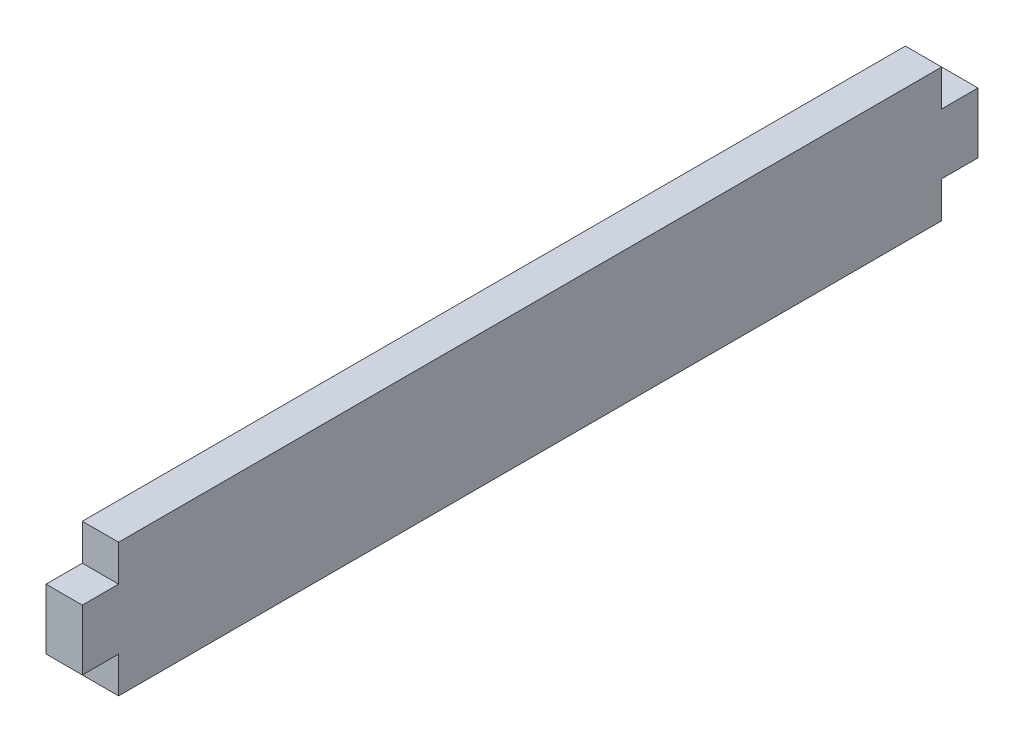
ISO-10303-21;
HEADER;
FILE_DESCRIPTION(('STEP AP214'),'2;1');
FILE_NAME('part.step','',(''),(''),'','','');
FILE_SCHEMA(('AUTOMOTIVE_DESIGN { 1 0 10303 214 1 1 1 1 }'));
ENDSEC;
DATA;
#1=APPLICATION_CONTEXT('core data for automotive mechanical design processes');
#2=APPLICATION_PROTOCOL_DEFINITION('international standard','automotive_design',2000,#1);
#3=PRODUCT_CONTEXT('',#1,'mechanical');
#4=PRODUCT('Part','Part','',(#3));
#5=PRODUCT_RELATED_PRODUCT_CATEGORY('part','',(#4));
#6=PRODUCT_DEFINITION_FORMATION('','',#4);
#7=PRODUCT_DEFINITION_CONTEXT('part definition',#1,'design');
#8=PRODUCT_DEFINITION('design','',#6,#7);
#9=PRODUCT_DEFINITION_SHAPE('','',#8);
#10=(LENGTH_UNIT() NAMED_UNIT(*) SI_UNIT(.MILLI.,.METRE.));
#11=(NAMED_UNIT(*) PLANE_ANGLE_UNIT() SI_UNIT($,.RADIAN.));
#12=(NAMED_UNIT(*) SI_UNIT($,.STERADIAN.) SOLID_ANGLE_UNIT());
#13=UNCERTAINTY_MEASURE_WITH_UNIT(LENGTH_MEASURE(1.E-05),#10,'distance_accuracy_value','');
#14=(GEOMETRIC_REPRESENTATION_CONTEXT(3) GLOBAL_UNCERTAINTY_ASSIGNED_CONTEXT((#13)) GLOBAL_UNIT_ASSIGNED_CONTEXT((#10,
#11,#12)) REPRESENTATION_CONTEXT('',''));
#15=CARTESIAN_POINT('',(0.,0.,0.));
#16=DIRECTION('',(0.,0.,1.));
#17=DIRECTION('',(1.,0.,0.));
#18=AXIS2_PLACEMENT_3D('',#15,#16,#17);
#19=CARTESIAN_POINT('',(-3.,3.,0.));
#20=DIRECTION('',(0.,-1.,0.));
#21=DIRECTION('',(0.,0.,-1.));
#22=AXIS2_PLACEMENT_3D('',#19,#20,#21);
#23=PLANE('',#22);
#24=DIRECTION('',(0.,0.,-1.));
#25=VECTOR('',#24,1.);
#26=CARTESIAN_POINT('',(0.,3.,0.));
#27=LINE('',#26,#25);
#28=CARTESIAN_POINT('',(0.,3.,0.));
#29=VERTEX_POINT('',#28);
#30=CARTESIAN_POINT('',(0.,3.,-3.));
#31=VERTEX_POINT('',#30);
#32=EDGE_CURVE('E145',#29,#31,#27,.T.);
#33=ORIENTED_EDGE('',*,*,#32,.F.);
#34=DIRECTION('',(1.,0.,0.));
#35=VECTOR('',#34,1.);
#36=CARTESIAN_POINT('',(-3.,3.,0.));
#37=LINE('',#36,#35);
#38=CARTESIAN_POINT('',(-3.,3.,0.));
#39=VERTEX_POINT('',#38);
#40=EDGE_CURVE('E32',#39,#29,#37,.T.);
#41=ORIENTED_EDGE('',*,*,#40,.F.);
#42=DIRECTION('',(0.,0.,-1.));
#43=VECTOR('',#42,1.);
#44=CARTESIAN_POINT('',(-3.,3.,0.));
#45=LINE('',#44,#43);
#46=CARTESIAN_POINT('',(-3.,3.,-3.));
#47=VERTEX_POINT('',#46);
#48=EDGE_CURVE('E136',#39,#47,#45,.T.);
#49=ORIENTED_EDGE('',*,*,#48,.T.);
#50=DIRECTION('',(1.,0.,0.));
#51=VECTOR('',#50,1.);
#52=CARTESIAN_POINT('',(-3.,3.,-3.));
#53=LINE('',#52,#51);
#54=EDGE_CURVE('E10',#47,#31,#53,.T.);
#55=ORIENTED_EDGE('',*,*,#54,.T.);
#56=EDGE_LOOP('',(#33,#41,#49,#55));
#57=FACE_BOUND('',#56,.T.);
#58=ADVANCED_FACE('F16',(#57),#23,.T.);
#59=CARTESIAN_POINT('',(-3.,3.,-3.));
#60=DIRECTION('',(0.,0.,-1.));
#61=DIRECTION('',(-1.,0.,0.));
#62=AXIS2_PLACEMENT_3D('',#59,#60,#61);
#63=PLANE('',#62);
#64=DIRECTION('',(0.,1.,0.));
#65=VECTOR('',#64,1.);
#66=CARTESIAN_POINT('',(0.,3.,-3.));
#67=LINE('',#66,#65);
#68=CARTESIAN_POINT('',(0.,7.99999999999999,-3.));
#69=VERTEX_POINT('',#68);
#70=EDGE_CURVE('E140',#31,#69,#67,.T.);
#71=ORIENTED_EDGE('',*,*,#70,.F.);
#72=ORIENTED_EDGE('',*,*,#54,.F.);
#73=DIRECTION('',(0.,1.,0.));
#74=VECTOR('',#73,1.);
#75=CARTESIAN_POINT('',(-3.,3.,-3.));
#76=LINE('',#75,#74);
#77=CARTESIAN_POINT('',(-3.,7.99999999999999,-3.));
#78=VERTEX_POINT('',#77);
#79=EDGE_CURVE('E138',#47,#78,#76,.T.);
#80=ORIENTED_EDGE('',*,*,#79,.T.);
#81=DIRECTION('',(1.,0.,0.));
#82=VECTOR('',#81,1.);
#83=CARTESIAN_POINT('',(-3.,7.99999999999999,-3.));
#84=LINE('',#83,#82);
#85=EDGE_CURVE('E24',#78,#69,#84,.T.);
#86=ORIENTED_EDGE('',*,*,#85,.T.);
#87=EDGE_LOOP('',(#71,#72,#80,#86));
#88=FACE_BOUND('',#87,.T.);
#89=ADVANCED_FACE('F198',(#88),#63,.T.);
#90=CARTESIAN_POINT('',(-3.,7.99999999999999,-3.));
#91=DIRECTION('',(0.,1.,0.));
#92=DIRECTION('',(0.,0.,1.));
#93=AXIS2_PLACEMENT_3D('',#90,#91,#92);
#94=PLANE('',#93);
#95=DIRECTION('',(0.,0.,1.));
#96=VECTOR('',#95,1.);
#97=CARTESIAN_POINT('',(0.,7.99999999999999,-3.));
#98=LINE('',#97,#96);
#99=CARTESIAN_POINT('',(0.,7.99999999999999,0.));
#100=VERTEX_POINT('',#99);
#101=EDGE_CURVE('E144',#69,#100,#98,.T.);
#102=ORIENTED_EDGE('',*,*,#101,.F.);
#103=ORIENTED_EDGE('',*,*,#85,.F.);
#104=DIRECTION('',(0.,0.,1.));
#105=VECTOR('',#104,1.);
#106=CARTESIAN_POINT('',(-3.,7.99999999999999,-3.));
#107=LINE('',#106,#105);
#108=CARTESIAN_POINT('',(-3.,7.99999999999999,0.));
#109=VERTEX_POINT('',#108);
#110=EDGE_CURVE('E207',#78,#109,#107,.T.);
#111=ORIENTED_EDGE('',*,*,#110,.T.);
#112=DIRECTION('',(1.,0.,0.));
#113=VECTOR('',#112,1.);
#114=CARTESIAN_POINT('',(-3.,7.99999999999999,0.));
#115=LINE('',#114,#113);
#116=EDGE_CURVE('E196',#109,#100,#115,.T.);
#117=ORIENTED_EDGE('',*,*,#116,.T.);
#118=EDGE_LOOP('',(#102,#103,#111,#117));
#119=FACE_BOUND('',#118,.T.);
#120=ADVANCED_FACE('F202',(#119),#94,.T.);
#121=CARTESIAN_POINT('',(-3.,7.99999999999999,0.));
#122=DIRECTION('',(0.,0.,-1.));
#123=DIRECTION('',(-1.,0.,0.));
#124=AXIS2_PLACEMENT_3D('',#121,#122,#123);
#125=PLANE('',#124);
#126=DIRECTION('',(0.,1.,0.));
#127=VECTOR('',#126,1.);
#128=CARTESIAN_POINT('',(0.,7.99999999999999,0.));
#129=LINE('',#128,#127);
#130=CARTESIAN_POINT('',(0.,11.,0.));
#131=VERTEX_POINT('',#130);
#132=EDGE_CURVE('E149',#100,#131,#129,.T.);
#133=ORIENTED_EDGE('',*,*,#132,.F.);
#134=ORIENTED_EDGE('',*,*,#116,.F.);
#135=DIRECTION('',(0.,1.,0.));
#136=VECTOR('',#135,1.);
#137=CARTESIAN_POINT('',(-3.,7.99999999999999,0.));
#138=LINE('',#137,#136);
#139=CARTESIAN_POINT('',(-3.,11.,0.));
#140=VERTEX_POINT('',#139);
#141=EDGE_CURVE('E209',#109,#140,#138,.T.);
#142=ORIENTED_EDGE('',*,*,#141,.T.);
#143=DIRECTION('',(1.,0.,0.));
#144=VECTOR('',#143,1.);
#145=CARTESIAN_POINT('',(-3.,11.,0.));
#146=LINE('',#145,#144);
#147=EDGE_CURVE('E194',#140,#131,#146,.T.);
#148=ORIENTED_EDGE('',*,*,#147,.T.);
#149=EDGE_LOOP('',(#133,#134,#142,#148));
#150=FACE_BOUND('',#149,.T.);
#151=ADVANCED_FACE('F245',(#150),#125,.T.);
#152=CARTESIAN_POINT('',(-3.,11.,0.));
#153=DIRECTION('',(0.,1.,0.));
#154=DIRECTION('',(0.,0.,1.));
#155=AXIS2_PLACEMENT_3D('',#152,#153,#154);
#156=PLANE('',#155);
#157=DIRECTION('',(0.,0.,1.));
#158=VECTOR('',#157,1.);
#159=CARTESIAN_POINT('',(0.,11.,0.));
#160=LINE('',#159,#158);
#161=CARTESIAN_POINT('',(0.,11.,68.));
#162=VERTEX_POINT('',#161);
#163=EDGE_CURVE('E153',#131,#162,#160,.T.);
#164=ORIENTED_EDGE('',*,*,#163,.F.);
#165=ORIENTED_EDGE('',*,*,#147,.F.);
#166=DIRECTION('',(0.,0.,1.));
#167=VECTOR('',#166,1.);
#168=CARTESIAN_POINT('',(-3.,11.,0.));
#169=LINE('',#168,#167);
#170=CARTESIAN_POINT('',(-3.,11.,68.));
#171=VERTEX_POINT('',#170);
#172=EDGE_CURVE('E214',#140,#171,#169,.T.);
#173=ORIENTED_EDGE('',*,*,#172,.T.);
#174=DIRECTION('',(1.,0.,0.));
#175=VECTOR('',#174,1.);
#176=CARTESIAN_POINT('',(-3.,11.,68.));
#177=LINE('',#176,#175);
#178=EDGE_CURVE('E192',#171,#162,#177,.T.);
#179=ORIENTED_EDGE('',*,*,#178,.T.);
#180=EDGE_LOOP('',(#164,#165,#173,#179));
#181=FACE_BOUND('',#180,.T.);
#182=ADVANCED_FACE('F243',(#181),#156,.T.);
#183=CARTESIAN_POINT('',(-3.,11.,68.));
#184=DIRECTION('',(0.,0.,1.));
#185=DIRECTION('',(1.,0.,0.));
#186=AXIS2_PLACEMENT_3D('',#183,#184,#185);
#187=PLANE('',#186);
#188=DIRECTION('',(0.,-1.,0.));
#189=VECTOR('',#188,1.);
#190=CARTESIAN_POINT('',(0.,11.,68.));
#191=LINE('',#190,#189);
#192=CARTESIAN_POINT('',(0.,7.99999999999999,68.));
#193=VERTEX_POINT('',#192);
#194=EDGE_CURVE('E157',#162,#193,#191,.T.);
#195=ORIENTED_EDGE('',*,*,#194,.F.);
#196=ORIENTED_EDGE('',*,*,#178,.F.);
#197=DIRECTION('',(0.,-1.,0.));
#198=VECTOR('',#197,1.);
#199=CARTESIAN_POINT('',(-3.,11.,68.));
#200=LINE('',#199,#198);
#201=CARTESIAN_POINT('',(-3.,7.99999999999999,68.));
#202=VERTEX_POINT('',#201);
#203=EDGE_CURVE('E217',#171,#202,#200,.T.);
#204=ORIENTED_EDGE('',*,*,#203,.T.);
#205=DIRECTION('',(1.,0.,0.));
#206=VECTOR('',#205,1.);
#207=CARTESIAN_POINT('',(-3.,7.99999999999999,68.));
#208=LINE('',#207,#206);
#209=EDGE_CURVE('E190',#202,#193,#208,.T.);
#210=ORIENTED_EDGE('',*,*,#209,.T.);
#211=EDGE_LOOP('',(#195,#196,#204,#210));
#212=FACE_BOUND('',#211,.T.);
#213=ADVANCED_FACE('F239',(#212),#187,.T.);
#214=CARTESIAN_POINT('',(-3.,7.99999999999999,68.));
#215=DIRECTION('',(0.,1.,0.));
#216=DIRECTION('',(0.,0.,1.));
#217=AXIS2_PLACEMENT_3D('',#214,#215,#216);
#218=PLANE('',#217);
#219=DIRECTION('',(0.,0.,1.));
#220=VECTOR('',#219,1.);
#221=CARTESIAN_POINT('',(0.,7.99999999999999,68.));
#222=LINE('',#221,#220);
#223=CARTESIAN_POINT('',(0.,7.99999999999999,71.));
#224=VERTEX_POINT('',#223);
#225=EDGE_CURVE('E161',#193,#224,#222,.T.);
#226=ORIENTED_EDGE('',*,*,#225,.F.);
#227=ORIENTED_EDGE('',*,*,#209,.F.);
#228=DIRECTION('',(0.,0.,1.));
#229=VECTOR('',#228,1.);
#230=CARTESIAN_POINT('',(-3.,7.99999999999999,68.));
#231=LINE('',#230,#229);
#232=CARTESIAN_POINT('',(-3.,7.99999999999999,71.));
#233=VERTEX_POINT('',#232);
#234=EDGE_CURVE('E220',#202,#233,#231,.T.);
#235=ORIENTED_EDGE('',*,*,#234,.T.);
#236=DIRECTION('',(1.,0.,0.));
#237=VECTOR('',#236,1.);
#238=CARTESIAN_POINT('',(-3.,7.99999999999999,71.));
#239=LINE('',#238,#237);
#240=EDGE_CURVE('E188',#233,#224,#239,.T.);
#241=ORIENTED_EDGE('',*,*,#240,.T.);
#242=EDGE_LOOP('',(#226,#227,#235,#241));
#243=FACE_BOUND('',#242,.T.);
#244=ADVANCED_FACE('F236',(#243),#218,.T.);
#245=CARTESIAN_POINT('',(-3.,7.99999999999999,71.));
#246=DIRECTION('',(0.,0.,1.));
#247=DIRECTION('',(1.,0.,0.));
#248=AXIS2_PLACEMENT_3D('',#245,#246,#247);
#249=PLANE('',#248);
#250=DIRECTION('',(0.,-1.,0.));
#251=VECTOR('',#250,1.);
#252=CARTESIAN_POINT('',(0.,7.99999999999999,71.));
#253=LINE('',#252,#251);
#254=CARTESIAN_POINT('',(0.,2.99999999999999,71.));
#255=VERTEX_POINT('',#254);
#256=EDGE_CURVE('E165',#224,#255,#253,.T.);
#257=ORIENTED_EDGE('',*,*,#256,.F.);
#258=ORIENTED_EDGE('',*,*,#240,.F.);
#259=DIRECTION('',(0.,-1.,0.));
#260=VECTOR('',#259,1.);
#261=CARTESIAN_POINT('',(-3.,7.99999999999999,71.));
#262=LINE('',#261,#260);
#263=CARTESIAN_POINT('',(-3.,2.99999999999999,71.));
#264=VERTEX_POINT('',#263);
#265=EDGE_CURVE('E223',#233,#264,#262,.T.);
#266=ORIENTED_EDGE('',*,*,#265,.T.);
#267=DIRECTION('',(1.,0.,0.));
#268=VECTOR('',#267,1.);
#269=CARTESIAN_POINT('',(-3.,2.99999999999999,71.));
#270=LINE('',#269,#268);
#271=EDGE_CURVE('E186',#264,#255,#270,.T.);
#272=ORIENTED_EDGE('',*,*,#271,.T.);
#273=EDGE_LOOP('',(#257,#258,#266,#272));
#274=FACE_BOUND('',#273,.T.);
#275=ADVANCED_FACE('F233',(#274),#249,.T.);
#276=CARTESIAN_POINT('',(-3.,2.99999999999999,71.));
#277=DIRECTION('',(0.,-1.,0.));
#278=DIRECTION('',(0.,0.,-1.));
#279=AXIS2_PLACEMENT_3D('',#276,#277,#278);
#280=PLANE('',#279);
#281=DIRECTION('',(0.,0.,-1.));
#282=VECTOR('',#281,1.);
#283=CARTESIAN_POINT('',(0.,2.99999999999999,71.));
#284=LINE('',#283,#282);
#285=CARTESIAN_POINT('',(0.,2.99999999999999,68.));
#286=VERTEX_POINT('',#285);
#287=EDGE_CURVE('E169',#255,#286,#284,.T.);
#288=ORIENTED_EDGE('',*,*,#287,.F.);
#289=ORIENTED_EDGE('',*,*,#271,.F.);
#290=DIRECTION('',(0.,0.,-1.));
#291=VECTOR('',#290,1.);
#292=CARTESIAN_POINT('',(-3.,2.99999999999999,71.));
#293=LINE('',#292,#291);
#294=CARTESIAN_POINT('',(-3.,2.99999999999999,68.));
#295=VERTEX_POINT('',#294);
#296=EDGE_CURVE('E127',#264,#295,#293,.T.);
#297=ORIENTED_EDGE('',*,*,#296,.T.);
#298=DIRECTION('',(1.,0.,0.));
#299=VECTOR('',#298,1.);
#300=CARTESIAN_POINT('',(-3.,2.99999999999999,68.));
#301=LINE('',#300,#299);
#302=EDGE_CURVE('E119',#295,#286,#301,.T.);
#303=ORIENTED_EDGE('',*,*,#302,.T.);
#304=EDGE_LOOP('',(#288,#289,#297,#303));
#305=FACE_BOUND('',#304,.T.);
#306=ADVANCED_FACE('F227',(#305),#280,.T.);
#307=CARTESIAN_POINT('',(-3.,2.99999999999999,68.));
#308=DIRECTION('',(0.,0.,1.));
#309=DIRECTION('',(1.,0.,0.));
#310=AXIS2_PLACEMENT_3D('',#307,#308,#309);
#311=PLANE('',#310);
#312=DIRECTION('',(0.,-1.,0.));
#313=VECTOR('',#312,1.);
#314=CARTESIAN_POINT('',(0.,2.99999999999999,68.));
#315=LINE('',#314,#313);
#316=CARTESIAN_POINT('',(0.,0.,68.));
#317=VERTEX_POINT('',#316);
#318=EDGE_CURVE('E173',#286,#317,#315,.T.);
#319=ORIENTED_EDGE('',*,*,#318,.F.);
#320=ORIENTED_EDGE('',*,*,#302,.F.);
#321=DIRECTION('',(0.,-1.,0.));
#322=VECTOR('',#321,1.);
#323=CARTESIAN_POINT('',(-3.,2.99999999999999,68.));
#324=LINE('',#323,#322);
#325=CARTESIAN_POINT('',(-3.,0.,68.));
#326=VERTEX_POINT('',#325);
#327=EDGE_CURVE('E122',#295,#326,#324,.T.);
#328=ORIENTED_EDGE('',*,*,#327,.T.);
#329=DIRECTION('',(1.,0.,0.));
#330=VECTOR('',#329,1.);
#331=CARTESIAN_POINT('',(-3.,0.,68.));
#332=LINE('',#331,#330);
#333=EDGE_CURVE('E108',#326,#317,#332,.T.);
#334=ORIENTED_EDGE('',*,*,#333,.T.);
#335=EDGE_LOOP('',(#319,#320,#328,#334));
#336=FACE_BOUND('',#335,.T.);
#337=ADVANCED_FACE('F123',(#336),#311,.T.);
#338=CARTESIAN_POINT('',(-3.,0.,68.));
#339=DIRECTION('',(0.,-1.,0.));
#340=DIRECTION('',(0.,0.,-1.));
#341=AXIS2_PLACEMENT_3D('',#338,#339,#340);
#342=PLANE('',#341);
#343=DIRECTION('',(0.,0.,-1.));
#344=VECTOR('',#343,1.);
#345=CARTESIAN_POINT('',(0.,0.,68.));
#346=LINE('',#345,#344);
#347=CARTESIAN_POINT('',(0.,0.,0.));
#348=VERTEX_POINT('',#347);
#349=EDGE_CURVE('E115',#317,#348,#346,.T.);
#350=ORIENTED_EDGE('',*,*,#349,.F.);
#351=ORIENTED_EDGE('',*,*,#333,.F.);
#352=DIRECTION('',(0.,0.,-1.));
#353=VECTOR('',#352,1.);
#354=CARTESIAN_POINT('',(-3.,0.,68.));
#355=LINE('',#354,#353);
#356=CARTESIAN_POINT('',(-3.,0.,0.));
#357=VERTEX_POINT('',#356);
#358=EDGE_CURVE('E112',#326,#357,#355,.T.);
#359=ORIENTED_EDGE('',*,*,#358,.T.);
#360=DIRECTION('',(1.,0.,0.));
#361=VECTOR('',#360,1.);
#362=CARTESIAN_POINT('',(-3.,0.,0.));
#363=LINE('',#362,#361);
#364=EDGE_CURVE('E72',#357,#348,#363,.T.);
#365=ORIENTED_EDGE('',*,*,#364,.T.);
#366=EDGE_LOOP('',(#350,#351,#359,#365));
#367=FACE_BOUND('',#366,.T.);
#368=ADVANCED_FACE('F110',(#367),#342,.T.);
#369=CARTESIAN_POINT('',(-3.,0.,0.));
#370=DIRECTION('',(0.,0.,-1.));
#371=DIRECTION('',(0.,1.,0.));
#372=AXIS2_PLACEMENT_3D('',#369,#370,#371);
#373=PLANE('',#372);
#374=DIRECTION('',(0.,1.,0.));
#375=VECTOR('',#374,1.);
#376=CARTESIAN_POINT('',(0.,0.,0.));
#377=LINE('',#376,#375);
#378=EDGE_CURVE('E139',#348,#29,#377,.T.);
#379=ORIENTED_EDGE('',*,*,#378,.F.);
#380=ORIENTED_EDGE('',*,*,#364,.F.);
#381=DIRECTION('',(0.,1.,0.));
#382=VECTOR('',#381,1.);
#383=CARTESIAN_POINT('',(-3.,0.,0.));
#384=LINE('',#383,#382);
#385=EDGE_CURVE('E131',#357,#39,#384,.T.);
#386=ORIENTED_EDGE('',*,*,#385,.T.);
#387=ORIENTED_EDGE('',*,*,#40,.T.);
#388=EDGE_LOOP('',(#379,#380,#386,#387));
#389=FACE_BOUND('',#388,.T.);
#390=ADVANCED_FACE('F337',(#389),#373,.T.);
#391=CARTESIAN_POINT('',(-3.,0.,0.));
#392=DIRECTION('',(1.,0.,0.));
#393=DIRECTION('',(0.,1.,0.));
#394=AXIS2_PLACEMENT_3D('',#391,#392,#393);
#395=PLANE('',#394);
#396=ORIENTED_EDGE('',*,*,#48,.F.);
#397=ORIENTED_EDGE('',*,*,#385,.F.);
#398=ORIENTED_EDGE('',*,*,#358,.F.);
#399=ORIENTED_EDGE('',*,*,#327,.F.);
#400=ORIENTED_EDGE('',*,*,#296,.F.);
#401=ORIENTED_EDGE('',*,*,#265,.F.);
#402=ORIENTED_EDGE('',*,*,#234,.F.);
#403=ORIENTED_EDGE('',*,*,#203,.F.);
#404=ORIENTED_EDGE('',*,*,#172,.F.);
#405=ORIENTED_EDGE('',*,*,#141,.F.);
#406=ORIENTED_EDGE('',*,*,#110,.F.);
#407=ORIENTED_EDGE('',*,*,#79,.F.);
#408=EDGE_LOOP('',(#396,#397,#398,#399,#400,#401,#402,#403,#404,#405,#406,#407));
#409=FACE_BOUND('',#408,.T.);
#410=ADVANCED_FACE('F130',(#409),#395,.F.);
#411=CARTESIAN_POINT('',(0.,0.,0.));
#412=DIRECTION('',(1.,0.,0.));
#413=DIRECTION('',(0.,1.,0.));
#414=AXIS2_PLACEMENT_3D('',#411,#412,#413);
#415=PLANE('',#414);
#416=ORIENTED_EDGE('',*,*,#32,.T.);
#417=ORIENTED_EDGE('',*,*,#70,.T.);
#418=ORIENTED_EDGE('',*,*,#101,.T.);
#419=ORIENTED_EDGE('',*,*,#132,.T.);
#420=ORIENTED_EDGE('',*,*,#163,.T.);
#421=ORIENTED_EDGE('',*,*,#194,.T.);
#422=ORIENTED_EDGE('',*,*,#225,.T.);
#423=ORIENTED_EDGE('',*,*,#256,.T.);
#424=ORIENTED_EDGE('',*,*,#287,.T.);
#425=ORIENTED_EDGE('',*,*,#318,.T.);
#426=ORIENTED_EDGE('',*,*,#349,.T.);
#427=ORIENTED_EDGE('',*,*,#378,.T.);
#428=EDGE_LOOP('',(#416,#417,#418,#419,#420,#421,#422,#423,#424,#425,#426,#427));
#429=FACE_BOUND('',#428,.T.);
#430=ADVANCED_FACE('F205',(#429),#415,.T.);
#431=CLOSED_SHELL('',(#58,#89,#120,#151,#182,#213,#244,#275,#306,#337,#368,#390,#410,#430));
#432=MANIFOLD_SOLID_BREP('B1',#431);
#433=ADVANCED_BREP_SHAPE_REPRESENTATION('',(#18,#432),#14);
#434=SHAPE_DEFINITION_REPRESENTATION(#9,#433);
ENDSEC;
END-ISO-10303-21;
